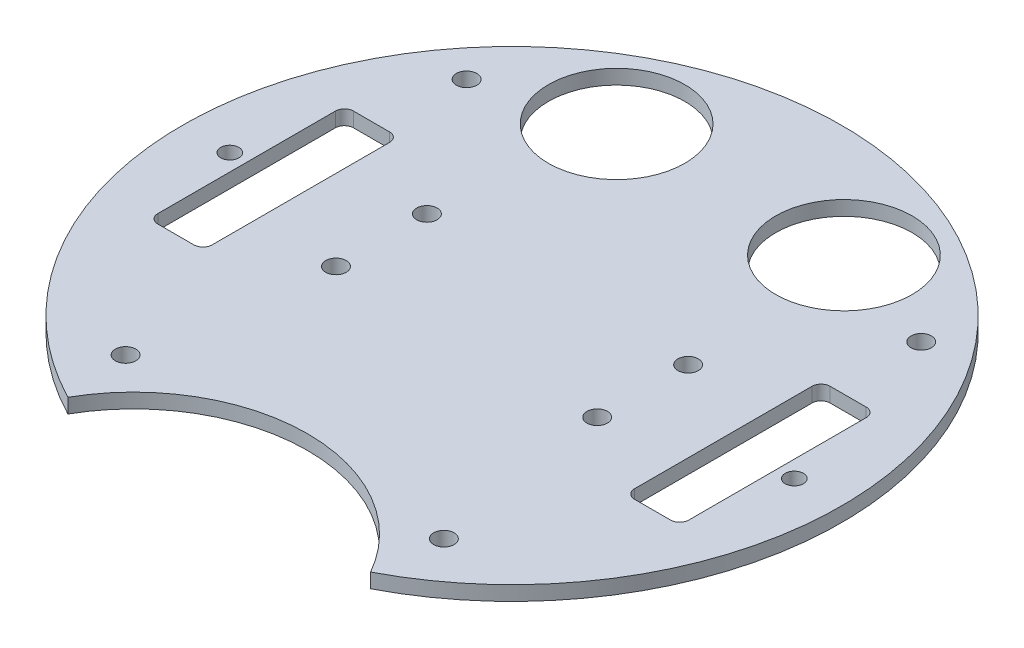
ISO-10303-21;
HEADER;
FILE_DESCRIPTION(('STEP AP214'),'2;1');
FILE_NAME('part.step','',(''),(''),'','','');
FILE_SCHEMA(('AUTOMOTIVE_DESIGN { 1 0 10303 214 1 1 1 1 }'));
ENDSEC;
DATA;
#1=APPLICATION_CONTEXT('core data for automotive mechanical design processes');
#2=APPLICATION_PROTOCOL_DEFINITION('international standard','automotive_design',2000,#1);
#3=PRODUCT_CONTEXT('',#1,'mechanical');
#4=PRODUCT('Part','Part','',(#3));
#5=PRODUCT_RELATED_PRODUCT_CATEGORY('part','',(#4));
#6=PRODUCT_DEFINITION_FORMATION('','',#4);
#7=PRODUCT_DEFINITION_CONTEXT('part definition',#1,'design');
#8=PRODUCT_DEFINITION('design','',#6,#7);
#9=PRODUCT_DEFINITION_SHAPE('','',#8);
#10=(LENGTH_UNIT() NAMED_UNIT(*) SI_UNIT(.MILLI.,.METRE.));
#11=(NAMED_UNIT(*) PLANE_ANGLE_UNIT() SI_UNIT($,.RADIAN.));
#12=(NAMED_UNIT(*) SI_UNIT($,.STERADIAN.) SOLID_ANGLE_UNIT());
#13=UNCERTAINTY_MEASURE_WITH_UNIT(LENGTH_MEASURE(1.E-05),#10,'distance_accuracy_value','');
#14=(GEOMETRIC_REPRESENTATION_CONTEXT(3) GLOBAL_UNCERTAINTY_ASSIGNED_CONTEXT((#13)) GLOBAL_UNIT_ASSIGNED_CONTEXT((#10,
#11,#12)) REPRESENTATION_CONTEXT('',''));
#15=CARTESIAN_POINT('',(0.,0.,0.));
#16=DIRECTION('',(0.,0.,1.));
#17=DIRECTION('',(1.,0.,0.));
#18=AXIS2_PLACEMENT_3D('',#15,#16,#17);
#19=CARTESIAN_POINT('',(0.,3.2,83.2397996376034));
#20=DIRECTION('',(0.,-1.,0.));
#21=DIRECTION('',(0.,0.,-1.));
#22=AXIS2_PLACEMENT_3D('',#19,#20,#21);
#23=CYLINDRICAL_SURFACE('',#22,38.25);
#24=CARTESIAN_POINT('',(0.,0.,83.2397996376034));
#25=DIRECTION('',(0.,-1.,0.));
#26=DIRECTION('',(0.,0.,1.));
#27=AXIS2_PLACEMENT_3D('',#24,#25,#26);
#28=CIRCLE('',#27,38.25);
#29=CARTESIAN_POINT('',(-33.2911053697012,0.,64.4045984636458));
#30=VERTEX_POINT('',#29);
#31=CARTESIAN_POINT('',(33.2911053697012,0.,64.4045984636458));
#32=VERTEX_POINT('',#31);
#33=EDGE_CURVE('E337',#30,#32,#28,.T.);
#34=ORIENTED_EDGE('',*,*,#33,.T.);
#35=DIRECTION('',(0.,-1.,0.));
#36=VECTOR('',#35,1.);
#37=CARTESIAN_POINT('',(33.2911053697012,3.2,64.4045984636458));
#38=LINE('',#37,#36);
#39=CARTESIAN_POINT('',(33.2911053697012,3.2,64.4045984636458));
#40=VERTEX_POINT('',#39);
#41=EDGE_CURVE('E11',#40,#32,#38,.T.);
#42=ORIENTED_EDGE('',*,*,#41,.F.);
#43=CARTESIAN_POINT('',(0.,3.2,83.2397996376034));
#44=DIRECTION('',(0.,-1.,0.));
#45=DIRECTION('',(0.,0.,1.));
#46=AXIS2_PLACEMENT_3D('',#43,#44,#45);
#47=CIRCLE('',#46,38.25);
#48=CARTESIAN_POINT('',(-33.2911053697012,3.2,64.4045984636458));
#49=VERTEX_POINT('',#48);
#50=EDGE_CURVE('E340',#49,#40,#47,.T.);
#51=ORIENTED_EDGE('',*,*,#50,.F.);
#52=DIRECTION('',(0.,-1.,0.));
#53=VECTOR('',#52,1.);
#54=CARTESIAN_POINT('',(-33.2911053697012,3.2,64.4045984636458));
#55=LINE('',#54,#53);
#56=EDGE_CURVE('E39',#49,#30,#55,.T.);
#57=ORIENTED_EDGE('',*,*,#56,.T.);
#58=EDGE_LOOP('',(#34,#42,#51,#57));
#59=FACE_BOUND('',#58,.T.);
#60=ADVANCED_FACE('F32',(#59),#23,.F.);
#61=CARTESIAN_POINT('',(0.,3.2,0.));
#62=DIRECTION('',(0.,-1.,0.));
#63=DIRECTION('',(0.,0.,-1.));
#64=AXIS2_PLACEMENT_3D('',#61,#62,#63);
#65=CYLINDRICAL_SURFACE('',#64,72.5);
#66=CARTESIAN_POINT('',(0.,0.,0.));
#67=DIRECTION('',(0.,1.,0.));
#68=DIRECTION('',(0.,0.,1.));
#69=AXIS2_PLACEMENT_3D('',#66,#67,#68);
#70=CIRCLE('',#69,72.5);
#71=EDGE_CURVE('E344',#32,#30,#70,.T.);
#72=ORIENTED_EDGE('',*,*,#71,.T.);
#73=ORIENTED_EDGE('',*,*,#56,.F.);
#74=CARTESIAN_POINT('',(0.,3.2,0.));
#75=DIRECTION('',(0.,1.,0.));
#76=DIRECTION('',(0.,0.,1.));
#77=AXIS2_PLACEMENT_3D('',#74,#75,#76);
#78=CIRCLE('',#77,72.5);
#79=EDGE_CURVE('E343',#40,#49,#78,.T.);
#80=ORIENTED_EDGE('',*,*,#79,.F.);
#81=ORIENTED_EDGE('',*,*,#41,.T.);
#82=EDGE_LOOP('',(#72,#73,#80,#81));
#83=FACE_BOUND('',#82,.T.);
#84=ADVANCED_FACE('F356',(#83),#65,.T.);
#85=CARTESIAN_POINT('',(0.,3.2,41.6198998188017));
#86=DIRECTION('',(0.,1.,0.));
#87=DIRECTION('',(0.,0.,1.));
#88=AXIS2_PLACEMENT_3D('',#85,#86,#87);
#89=PLANE('',#88);
#90=CARTESIAN_POINT('',(-35.,3.2,50.));
#91=DIRECTION('',(0.,1.,0.));
#92=DIRECTION('',(0.,0.,1.));
#93=AXIS2_PLACEMENT_3D('',#90,#91,#92);
#94=CIRCLE('',#93,2.25);
#95=CARTESIAN_POINT('',(-35.,3.2,52.25));
#96=VERTEX_POINT('',#95);
#97=EDGE_CURVE('E671',#96,#96,#94,.T.);
#98=ORIENTED_EDGE('',*,*,#97,.F.);
#99=EDGE_LOOP('',(#98));
#100=FACE_BOUND('',#99,.T.);
#101=CARTESIAN_POINT('',(35.,3.2,50.));
#102=DIRECTION('',(0.,1.,0.));
#103=DIRECTION('',(0.,0.,-1.));
#104=AXIS2_PLACEMENT_3D('',#101,#102,#103);
#105=CIRCLE('',#104,2.25);
#106=CARTESIAN_POINT('',(35.,3.2,47.7499999999999));
#107=VERTEX_POINT('',#106);
#108=EDGE_CURVE('E677',#107,#107,#105,.T.);
#109=ORIENTED_EDGE('',*,*,#108,.F.);
#110=EDGE_LOOP('',(#109));
#111=FACE_BOUND('',#110,.T.);
#112=CARTESIAN_POINT('',(50.,3.2,-40.));
#113=DIRECTION('',(0.,1.,0.));
#114=DIRECTION('',(0.,0.,-1.));
#115=AXIS2_PLACEMENT_3D('',#112,#113,#114);
#116=CIRCLE('',#115,2.25);
#117=CARTESIAN_POINT('',(50.,3.2,-42.25));
#118=VERTEX_POINT('',#117);
#119=EDGE_CURVE('E685',#118,#118,#116,.T.);
#120=ORIENTED_EDGE('',*,*,#119,.F.);
#121=EDGE_LOOP('',(#120));
#122=FACE_BOUND('',#121,.T.);
#123=CARTESIAN_POINT('',(-50.,3.2,-40.));
#124=DIRECTION('',(0.,1.,0.));
#125=DIRECTION('',(0.,0.,1.));
#126=AXIS2_PLACEMENT_3D('',#123,#124,#125);
#127=CIRCLE('',#126,2.25);
#128=CARTESIAN_POINT('',(-50.,3.2,-37.75));
#129=VERTEX_POINT('',#128);
#130=EDGE_CURVE('E674',#129,#129,#127,.T.);
#131=ORIENTED_EDGE('',*,*,#130,.F.);
#132=EDGE_LOOP('',(#131));
#133=FACE_BOUND('',#132,.T.);
#134=CARTESIAN_POINT('',(56.3857864376268,3.2,19.5201365909513));
#135=DIRECTION('',(0.,1.,0.));
#136=DIRECTION('',(0.,0.,-1.));
#137=AXIS2_PLACEMENT_3D('',#134,#135,#136);
#138=CIRCLE('',#137,2.);
#139=CARTESIAN_POINT('',(56.3857864376268,3.2,21.5201365909513));
#140=VERTEX_POINT('',#139);
#141=CARTESIAN_POINT('',(58.3857864376268,3.2,19.5201365909513));
#142=VERTEX_POINT('',#141);
#143=EDGE_CURVE('E206',#140,#142,#138,.T.);
#144=ORIENTED_EDGE('',*,*,#143,.F.);
#145=DIRECTION('',(1.,0.,0.));
#146=VECTOR('',#145,1.);
#147=CARTESIAN_POINT('',(56.3857864376268,3.2,21.5201365909513));
#148=LINE('',#147,#146);
#149=CARTESIAN_POINT('',(48.454213562373,3.2,21.5201365909513));
#150=VERTEX_POINT('',#149);
#151=EDGE_CURVE('E203',#150,#140,#148,.T.);
#152=ORIENTED_EDGE('',*,*,#151,.F.);
#153=CARTESIAN_POINT('',(48.454213562373,3.2,19.5201365909513));
#154=DIRECTION('',(0.,1.,0.));
#155=DIRECTION('',(0.,0.,-1.));
#156=AXIS2_PLACEMENT_3D('',#153,#154,#155);
#157=CIRCLE('',#156,2.);
#158=CARTESIAN_POINT('',(46.454213562373,3.2,19.5201365909513));
#159=VERTEX_POINT('',#158);
#160=EDGE_CURVE('E201',#159,#150,#157,.T.);
#161=ORIENTED_EDGE('',*,*,#160,.F.);
#162=DIRECTION('',(0.,0.,1.));
#163=VECTOR('',#162,1.);
#164=CARTESIAN_POINT('',(46.454213562373,3.2,-19.5201365909514));
#165=LINE('',#164,#163);
#166=CARTESIAN_POINT('',(46.454213562373,3.2,-19.5201365909514));
#167=VERTEX_POINT('',#166);
#168=EDGE_CURVE('E198',#167,#159,#165,.T.);
#169=ORIENTED_EDGE('',*,*,#168,.F.);
#170=CARTESIAN_POINT('',(48.454213562373,3.2,-19.5201365909514));
#171=DIRECTION('',(0.,1.,0.));
#172=DIRECTION('',(0.,0.,1.));
#173=AXIS2_PLACEMENT_3D('',#170,#171,#172);
#174=CIRCLE('',#173,2.);
#175=CARTESIAN_POINT('',(48.454213562373,3.2,-21.5201365909514));
#176=VERTEX_POINT('',#175);
#177=EDGE_CURVE('E196',#176,#167,#174,.T.);
#178=ORIENTED_EDGE('',*,*,#177,.F.);
#179=DIRECTION('',(-1.,0.,0.));
#180=VECTOR('',#179,1.);
#181=CARTESIAN_POINT('',(56.3857864376268,3.2,-21.5201365909514));
#182=LINE('',#181,#180);
#183=CARTESIAN_POINT('',(56.3857864376268,3.2,-21.5201365909514));
#184=VERTEX_POINT('',#183);
#185=EDGE_CURVE('E193',#184,#176,#182,.T.);
#186=ORIENTED_EDGE('',*,*,#185,.F.);
#187=CARTESIAN_POINT('',(56.3857864376268,3.2,-19.5201365909514));
#188=DIRECTION('',(0.,1.,0.));
#189=DIRECTION('',(0.,0.,-1.));
#190=AXIS2_PLACEMENT_3D('',#187,#188,#189);
#191=CIRCLE('',#190,1.99999999999999);
#192=CARTESIAN_POINT('',(58.3857864376268,3.2,-19.5201365909514));
#193=VERTEX_POINT('',#192);
#194=EDGE_CURVE('E172',#193,#184,#191,.T.);
#195=ORIENTED_EDGE('',*,*,#194,.F.);
#196=DIRECTION('',(0.,0.,-1.));
#197=VECTOR('',#196,1.);
#198=CARTESIAN_POINT('',(58.3857864376268,3.2,-19.5201365909514));
#199=LINE('',#198,#197);
#200=EDGE_CURVE('E169',#142,#193,#199,.T.);
#201=ORIENTED_EDGE('',*,*,#200,.F.);
#202=EDGE_LOOP('',(#144,#152,#161,#169,#178,#186,#195,#201));
#203=FACE_BOUND('',#202,.T.);
#204=CARTESIAN_POINT('',(-56.3857864376268,3.2,-19.5201365909514));
#205=DIRECTION('',(0.,1.,0.));
#206=DIRECTION('',(0.,0.,1.));
#207=AXIS2_PLACEMENT_3D('',#204,#205,#206);
#208=CIRCLE('',#207,1.99999999999999);
#209=CARTESIAN_POINT('',(-56.3857864376268,3.2,-21.5201365909514));
#210=VERTEX_POINT('',#209);
#211=CARTESIAN_POINT('',(-58.3857864376268,3.2,-19.5201365909514));
#212=VERTEX_POINT('',#211);
#213=EDGE_CURVE('E265',#210,#212,#208,.T.);
#214=ORIENTED_EDGE('',*,*,#213,.F.);
#215=DIRECTION('',(-1.,0.,0.));
#216=VECTOR('',#215,1.);
#217=CARTESIAN_POINT('',(-56.3857864376268,3.2,-21.5201365909514));
#218=LINE('',#217,#216);
#219=CARTESIAN_POINT('',(-48.454213562373,3.2,-21.5201365909514));
#220=VERTEX_POINT('',#219);
#221=EDGE_CURVE('E262',#220,#210,#218,.T.);
#222=ORIENTED_EDGE('',*,*,#221,.F.);
#223=CARTESIAN_POINT('',(-48.454213562373,3.2,-19.5201365909514));
#224=DIRECTION('',(0.,1.,0.));
#225=DIRECTION('',(0.,0.,-1.));
#226=AXIS2_PLACEMENT_3D('',#223,#224,#225);
#227=CIRCLE('',#226,2.);
#228=CARTESIAN_POINT('',(-46.454213562373,3.2,-19.5201365909514));
#229=VERTEX_POINT('',#228);
#230=EDGE_CURVE('E260',#229,#220,#227,.T.);
#231=ORIENTED_EDGE('',*,*,#230,.F.);
#232=DIRECTION('',(0.,0.,-1.));
#233=VECTOR('',#232,1.);
#234=CARTESIAN_POINT('',(-46.454213562373,3.2,-19.5201365909514));
#235=LINE('',#234,#233);
#236=CARTESIAN_POINT('',(-46.454213562373,3.2,19.5201365909513));
#237=VERTEX_POINT('',#236);
#238=EDGE_CURVE('E257',#237,#229,#235,.T.);
#239=ORIENTED_EDGE('',*,*,#238,.F.);
#240=CARTESIAN_POINT('',(-48.454213562373,3.2,19.5201365909513));
#241=DIRECTION('',(0.,1.,0.));
#242=DIRECTION('',(0.,0.,1.));
#243=AXIS2_PLACEMENT_3D('',#240,#241,#242);
#244=CIRCLE('',#243,2.);
#245=CARTESIAN_POINT('',(-48.454213562373,3.2,21.5201365909513));
#246=VERTEX_POINT('',#245);
#247=EDGE_CURVE('E255',#246,#237,#244,.T.);
#248=ORIENTED_EDGE('',*,*,#247,.F.);
#249=DIRECTION('',(1.,0.,0.));
#250=VECTOR('',#249,1.);
#251=CARTESIAN_POINT('',(-56.3857864376268,3.2,21.5201365909513));
#252=LINE('',#251,#250);
#253=CARTESIAN_POINT('',(-56.3857864376268,3.2,21.5201365909513));
#254=VERTEX_POINT('',#253);
#255=EDGE_CURVE('E252',#254,#246,#252,.T.);
#256=ORIENTED_EDGE('',*,*,#255,.F.);
#257=CARTESIAN_POINT('',(-56.3857864376268,3.2,19.5201365909513));
#258=DIRECTION('',(0.,1.,0.));
#259=DIRECTION('',(0.,0.,1.));
#260=AXIS2_PLACEMENT_3D('',#257,#258,#259);
#261=CIRCLE('',#260,2.);
#262=CARTESIAN_POINT('',(-58.3857864376268,3.2,19.5201365909513));
#263=VERTEX_POINT('',#262);
#264=EDGE_CURVE('E212',#263,#254,#261,.T.);
#265=ORIENTED_EDGE('',*,*,#264,.F.);
#266=DIRECTION('',(0.,0.,1.));
#267=VECTOR('',#266,1.);
#268=CARTESIAN_POINT('',(-58.3857864376268,3.2,-19.5201365909514));
#269=LINE('',#268,#267);
#270=EDGE_CURVE('E232',#212,#263,#269,.T.);
#271=ORIENTED_EDGE('',*,*,#270,.F.);
#272=EDGE_LOOP('',(#214,#222,#231,#239,#248,#256,#265,#271));
#273=FACE_BOUND('',#272,.T.);
#274=CARTESIAN_POINT('',(25.,3.2,-48.));
#275=DIRECTION('',(0.,1.,0.));
#276=DIRECTION('',(0.,0.,-1.));
#277=AXIS2_PLACEMENT_3D('',#274,#275,#276);
#278=CIRCLE('',#277,15.);
#279=CARTESIAN_POINT('',(25.,3.2,-63.));
#280=VERTEX_POINT('',#279);
#281=EDGE_CURVE('E271',#280,#280,#278,.T.);
#282=ORIENTED_EDGE('',*,*,#281,.F.);
#283=EDGE_LOOP('',(#282));
#284=FACE_BOUND('',#283,.T.);
#285=CARTESIAN_POINT('',(-25.,3.2,-48.));
#286=DIRECTION('',(0.,1.,0.));
#287=DIRECTION('',(0.,0.,1.));
#288=AXIS2_PLACEMENT_3D('',#285,#286,#287);
#289=CIRCLE('',#288,15.);
#290=CARTESIAN_POINT('',(-25.,3.2,-33.));
#291=VERTEX_POINT('',#290);
#292=EDGE_CURVE('E295',#291,#291,#289,.T.);
#293=ORIENTED_EDGE('',*,*,#292,.F.);
#294=EDGE_LOOP('',(#293));
#295=FACE_BOUND('',#294,.T.);
#296=CARTESIAN_POINT('',(-28.7299999999999,3.2,9.99999999999995));
#297=DIRECTION('',(0.,-1.,0.));
#298=DIRECTION('',(0.,0.,-1.));
#299=AXIS2_PLACEMENT_3D('',#296,#297,#298);
#300=CIRCLE('',#299,2.25);
#301=CARTESIAN_POINT('',(-28.7299999999999,3.2,7.74999999999995));
#302=VERTEX_POINT('',#301);
#303=EDGE_CURVE('E304',#302,#302,#300,.T.);
#304=ORIENTED_EDGE('',*,*,#303,.T.);
#305=EDGE_LOOP('',(#304));
#306=FACE_BOUND('',#305,.T.);
#307=CARTESIAN_POINT('',(-28.7299999999999,3.2,-10.0000000000001));
#308=DIRECTION('',(0.,-1.,0.));
#309=DIRECTION('',(0.,0.,-1.));
#310=AXIS2_PLACEMENT_3D('',#307,#308,#309);
#311=CIRCLE('',#310,2.25);
#312=CARTESIAN_POINT('',(-28.7299999999999,3.2,-12.2500000000001));
#313=VERTEX_POINT('',#312);
#314=EDGE_CURVE('E311',#313,#313,#311,.T.);
#315=ORIENTED_EDGE('',*,*,#314,.T.);
#316=EDGE_LOOP('',(#315));
#317=FACE_BOUND('',#316,.T.);
#318=CARTESIAN_POINT('',(28.7299999999999,3.2,-10.));
#319=DIRECTION('',(0.,-1.,0.));
#320=DIRECTION('',(0.,0.,1.));
#321=AXIS2_PLACEMENT_3D('',#318,#319,#320);
#322=CIRCLE('',#321,2.25000000000001);
#323=CARTESIAN_POINT('',(28.7299999999999,3.2,-7.75000000000004));
#324=VERTEX_POINT('',#323);
#325=EDGE_CURVE('E317',#324,#324,#322,.T.);
#326=ORIENTED_EDGE('',*,*,#325,.T.);
#327=EDGE_LOOP('',(#326));
#328=FACE_BOUND('',#327,.T.);
#329=CARTESIAN_POINT('',(28.7299999999999,3.2,9.99999999999996));
#330=DIRECTION('',(0.,-1.,0.));
#331=DIRECTION('',(0.,0.,1.));
#332=AXIS2_PLACEMENT_3D('',#329,#330,#331);
#333=CIRCLE('',#332,2.25000000000001);
#334=CARTESIAN_POINT('',(28.7299999999999,3.2,12.25));
#335=VERTEX_POINT('',#334);
#336=EDGE_CURVE('E323',#335,#335,#333,.T.);
#337=ORIENTED_EDGE('',*,*,#336,.T.);
#338=EDGE_LOOP('',(#337));
#339=FACE_BOUND('',#338,.T.);
#340=CARTESIAN_POINT('',(62.08,3.2,0.));
#341=DIRECTION('',(0.,-1.,0.));
#342=DIRECTION('',(0.,0.,1.));
#343=AXIS2_PLACEMENT_3D('',#340,#341,#342);
#344=CIRCLE('',#343,1.99999999999999);
#345=CARTESIAN_POINT('',(62.08,3.2,1.99999999999992));
#346=VERTEX_POINT('',#345);
#347=EDGE_CURVE('E329',#346,#346,#344,.T.);
#348=ORIENTED_EDGE('',*,*,#347,.T.);
#349=EDGE_LOOP('',(#348));
#350=FACE_BOUND('',#349,.T.);
#351=CARTESIAN_POINT('',(-62.08,3.2,0.));
#352=DIRECTION('',(0.,-1.,0.));
#353=DIRECTION('',(0.,0.,-1.));
#354=AXIS2_PLACEMENT_3D('',#351,#352,#353);
#355=CIRCLE('',#354,2.);
#356=CARTESIAN_POINT('',(-62.08,3.2,-2.00000000000008));
#357=VERTEX_POINT('',#356);
#358=EDGE_CURVE('E334',#357,#357,#355,.T.);
#359=ORIENTED_EDGE('',*,*,#358,.T.);
#360=EDGE_LOOP('',(#359));
#361=FACE_BOUND('',#360,.T.);
#362=ORIENTED_EDGE('',*,*,#50,.T.);
#363=ORIENTED_EDGE('',*,*,#79,.T.);
#364=EDGE_LOOP('',(#362,#363));
#365=FACE_BOUND('',#364,.T.);
#366=ADVANCED_FACE('F358',(#100,#111,#122,#133,#203,#273,#284,#295,#306,#317,#328,#339,#350,
#361,#365),#89,.T.);
#367=CARTESIAN_POINT('',(0.,0.,41.6198998188017));
#368=DIRECTION('',(0.,1.,0.));
#369=DIRECTION('',(0.,0.,1.));
#370=AXIS2_PLACEMENT_3D('',#367,#368,#369);
#371=PLANE('',#370);
#372=CARTESIAN_POINT('',(-35.,0.,50.));
#373=DIRECTION('',(0.,1.,0.));
#374=DIRECTION('',(0.,0.,1.));
#375=AXIS2_PLACEMENT_3D('',#372,#373,#374);
#376=CIRCLE('',#375,2.25);
#377=CARTESIAN_POINT('',(-35.,0.,52.25));
#378=VERTEX_POINT('',#377);
#379=EDGE_CURVE('E669',#378,#378,#376,.T.);
#380=ORIENTED_EDGE('',*,*,#379,.T.);
#381=EDGE_LOOP('',(#380));
#382=FACE_BOUND('',#381,.T.);
#383=CARTESIAN_POINT('',(35.,0.,50.));
#384=DIRECTION('',(0.,1.,0.));
#385=DIRECTION('',(0.,0.,-1.));
#386=AXIS2_PLACEMENT_3D('',#383,#384,#385);
#387=CIRCLE('',#386,2.25);
#388=CARTESIAN_POINT('',(35.,0.,47.7499999999999));
#389=VERTEX_POINT('',#388);
#390=EDGE_CURVE('E672',#389,#389,#387,.T.);
#391=ORIENTED_EDGE('',*,*,#390,.T.);
#392=EDGE_LOOP('',(#391));
#393=FACE_BOUND('',#392,.T.);
#394=CARTESIAN_POINT('',(50.,0.,-40.));
#395=DIRECTION('',(0.,1.,0.));
#396=DIRECTION('',(0.,0.,-1.));
#397=AXIS2_PLACEMENT_3D('',#394,#395,#396);
#398=CIRCLE('',#397,2.25);
#399=CARTESIAN_POINT('',(50.,0.,-42.25));
#400=VERTEX_POINT('',#399);
#401=EDGE_CURVE('E682',#400,#400,#398,.T.);
#402=ORIENTED_EDGE('',*,*,#401,.T.);
#403=EDGE_LOOP('',(#402));
#404=FACE_BOUND('',#403,.T.);
#405=CARTESIAN_POINT('',(-50.,0.,-40.));
#406=DIRECTION('',(0.,1.,0.));
#407=DIRECTION('',(0.,0.,1.));
#408=AXIS2_PLACEMENT_3D('',#405,#406,#407);
#409=CIRCLE('',#408,2.25);
#410=CARTESIAN_POINT('',(-50.,0.,-37.75));
#411=VERTEX_POINT('',#410);
#412=EDGE_CURVE('E194',#411,#411,#409,.T.);
#413=ORIENTED_EDGE('',*,*,#412,.T.);
#414=EDGE_LOOP('',(#413));
#415=FACE_BOUND('',#414,.T.);
#416=DIRECTION('',(1.,0.,0.));
#417=VECTOR('',#416,1.);
#418=CARTESIAN_POINT('',(56.3857864376268,0.,21.5201365909513));
#419=LINE('',#418,#417);
#420=CARTESIAN_POINT('',(48.454213562373,0.,21.5201365909513));
#421=VERTEX_POINT('',#420);
#422=CARTESIAN_POINT('',(56.3857864376268,0.,21.5201365909513));
#423=VERTEX_POINT('',#422);
#424=EDGE_CURVE('E187',#421,#423,#419,.T.);
#425=ORIENTED_EDGE('',*,*,#424,.T.);
#426=CARTESIAN_POINT('',(56.3857864376268,0.,19.5201365909513));
#427=DIRECTION('',(0.,1.,0.));
#428=DIRECTION('',(0.,0.,-1.));
#429=AXIS2_PLACEMENT_3D('',#426,#427,#428);
#430=CIRCLE('',#429,2.);
#431=CARTESIAN_POINT('',(58.3857864376268,0.,19.5201365909513));
#432=VERTEX_POINT('',#431);
#433=EDGE_CURVE('E189',#423,#432,#430,.T.);
#434=ORIENTED_EDGE('',*,*,#433,.T.);
#435=DIRECTION('',(0.,0.,-1.));
#436=VECTOR('',#435,1.);
#437=CARTESIAN_POINT('',(58.3857864376268,0.,-19.5201365909514));
#438=LINE('',#437,#436);
#439=CARTESIAN_POINT('',(58.3857864376268,0.,-19.5201365909514));
#440=VERTEX_POINT('',#439);
#441=EDGE_CURVE('E166',#432,#440,#438,.T.);
#442=ORIENTED_EDGE('',*,*,#441,.T.);
#443=CARTESIAN_POINT('',(56.3857864376268,0.,-19.5201365909514));
#444=DIRECTION('',(0.,1.,0.));
#445=DIRECTION('',(0.,0.,-1.));
#446=AXIS2_PLACEMENT_3D('',#443,#444,#445);
#447=CIRCLE('',#446,1.99999999999999);
#448=CARTESIAN_POINT('',(56.3857864376268,0.,-21.5201365909514));
#449=VERTEX_POINT('',#448);
#450=EDGE_CURVE('E160',#440,#449,#447,.T.);
#451=ORIENTED_EDGE('',*,*,#450,.T.);
#452=DIRECTION('',(-1.,0.,0.));
#453=VECTOR('',#452,1.);
#454=CARTESIAN_POINT('',(56.3857864376268,0.,-21.5201365909514));
#455=LINE('',#454,#453);
#456=CARTESIAN_POINT('',(48.454213562373,0.,-21.5201365909514));
#457=VERTEX_POINT('',#456);
#458=EDGE_CURVE('E164',#449,#457,#455,.T.);
#459=ORIENTED_EDGE('',*,*,#458,.T.);
#460=CARTESIAN_POINT('',(48.454213562373,0.,-19.5201365909514));
#461=DIRECTION('',(0.,1.,0.));
#462=DIRECTION('',(0.,0.,1.));
#463=AXIS2_PLACEMENT_3D('',#460,#461,#462);
#464=CIRCLE('',#463,2.);
#465=CARTESIAN_POINT('',(46.454213562373,0.,-19.5201365909514));
#466=VERTEX_POINT('',#465);
#467=EDGE_CURVE('E54',#457,#466,#464,.T.);
#468=ORIENTED_EDGE('',*,*,#467,.T.);
#469=DIRECTION('',(0.,0.,1.));
#470=VECTOR('',#469,1.);
#471=CARTESIAN_POINT('',(46.454213562373,0.,-19.5201365909514));
#472=LINE('',#471,#470);
#473=CARTESIAN_POINT('',(46.454213562373,0.,19.5201365909513));
#474=VERTEX_POINT('',#473);
#475=EDGE_CURVE('E178',#466,#474,#472,.T.);
#476=ORIENTED_EDGE('',*,*,#475,.T.);
#477=CARTESIAN_POINT('',(48.454213562373,0.,19.5201365909513));
#478=DIRECTION('',(0.,1.,0.));
#479=DIRECTION('',(0.,0.,-1.));
#480=AXIS2_PLACEMENT_3D('',#477,#478,#479);
#481=CIRCLE('',#480,2.);
#482=EDGE_CURVE('E184',#474,#421,#481,.T.);
#483=ORIENTED_EDGE('',*,*,#482,.T.);
#484=EDGE_LOOP('',(#425,#434,#442,#451,#459,#468,#476,#483));
#485=FACE_BOUND('',#484,.T.);
#486=DIRECTION('',(-1.,0.,0.));
#487=VECTOR('',#486,1.);
#488=CARTESIAN_POINT('',(-56.3857864376268,0.,-21.5201365909514));
#489=LINE('',#488,#487);
#490=CARTESIAN_POINT('',(-48.454213562373,0.,-21.5201365909514));
#491=VERTEX_POINT('',#490);
#492=CARTESIAN_POINT('',(-56.3857864376268,0.,-21.5201365909514));
#493=VERTEX_POINT('',#492);
#494=EDGE_CURVE('E242',#491,#493,#489,.T.);
#495=ORIENTED_EDGE('',*,*,#494,.T.);
#496=CARTESIAN_POINT('',(-56.3857864376268,0.,-19.5201365909514));
#497=DIRECTION('',(0.,1.,0.));
#498=DIRECTION('',(0.,0.,1.));
#499=AXIS2_PLACEMENT_3D('',#496,#497,#498);
#500=CIRCLE('',#499,1.99999999999999);
#501=CARTESIAN_POINT('',(-58.3857864376268,0.,-19.5201365909514));
#502=VERTEX_POINT('',#501);
#503=EDGE_CURVE('E245',#493,#502,#500,.T.);
#504=ORIENTED_EDGE('',*,*,#503,.T.);
#505=DIRECTION('',(0.,0.,1.));
#506=VECTOR('',#505,1.);
#507=CARTESIAN_POINT('',(-58.3857864376268,0.,-19.5201365909514));
#508=LINE('',#507,#506);
#509=CARTESIAN_POINT('',(-58.3857864376268,0.,19.5201365909513));
#510=VERTEX_POINT('',#509);
#511=EDGE_CURVE('E247',#502,#510,#508,.T.);
#512=ORIENTED_EDGE('',*,*,#511,.T.);
#513=CARTESIAN_POINT('',(-56.3857864376268,0.,19.5201365909513));
#514=DIRECTION('',(0.,1.,0.));
#515=DIRECTION('',(0.,0.,1.));
#516=AXIS2_PLACEMENT_3D('',#513,#514,#515);
#517=CIRCLE('',#516,2.);
#518=CARTESIAN_POINT('',(-56.3857864376268,0.,21.5201365909513));
#519=VERTEX_POINT('',#518);
#520=EDGE_CURVE('E228',#510,#519,#517,.T.);
#521=ORIENTED_EDGE('',*,*,#520,.T.);
#522=DIRECTION('',(1.,0.,0.));
#523=VECTOR('',#522,1.);
#524=CARTESIAN_POINT('',(-56.3857864376268,0.,21.5201365909513));
#525=LINE('',#524,#523);
#526=CARTESIAN_POINT('',(-48.454213562373,0.,21.5201365909513));
#527=VERTEX_POINT('',#526);
#528=EDGE_CURVE('E231',#519,#527,#525,.T.);
#529=ORIENTED_EDGE('',*,*,#528,.T.);
#530=CARTESIAN_POINT('',(-48.454213562373,0.,19.5201365909513));
#531=DIRECTION('',(0.,1.,0.));
#532=DIRECTION('',(0.,0.,1.));
#533=AXIS2_PLACEMENT_3D('',#530,#531,#532);
#534=CIRCLE('',#533,2.);
#535=CARTESIAN_POINT('',(-46.454213562373,0.,19.5201365909513));
#536=VERTEX_POINT('',#535);
#537=EDGE_CURVE('E235',#527,#536,#534,.T.);
#538=ORIENTED_EDGE('',*,*,#537,.T.);
#539=DIRECTION('',(0.,0.,-1.));
#540=VECTOR('',#539,1.);
#541=CARTESIAN_POINT('',(-46.454213562373,0.,-19.5201365909514));
#542=LINE('',#541,#540);
#543=CARTESIAN_POINT('',(-46.454213562373,0.,-19.5201365909514));
#544=VERTEX_POINT('',#543);
#545=EDGE_CURVE('E237',#536,#544,#542,.T.);
#546=ORIENTED_EDGE('',*,*,#545,.T.);
#547=CARTESIAN_POINT('',(-48.454213562373,0.,-19.5201365909514));
#548=DIRECTION('',(0.,1.,0.));
#549=DIRECTION('',(0.,0.,-1.));
#550=AXIS2_PLACEMENT_3D('',#547,#548,#549);
#551=CIRCLE('',#550,2.);
#552=EDGE_CURVE('E240',#544,#491,#551,.T.);
#553=ORIENTED_EDGE('',*,*,#552,.T.);
#554=EDGE_LOOP('',(#495,#504,#512,#521,#529,#538,#546,#553));
#555=FACE_BOUND('',#554,.T.);
#556=CARTESIAN_POINT('',(25.,0.,-48.));
#557=DIRECTION('',(0.,1.,0.));
#558=DIRECTION('',(0.,0.,-1.));
#559=AXIS2_PLACEMENT_3D('',#556,#557,#558);
#560=CIRCLE('',#559,15.);
#561=CARTESIAN_POINT('',(25.,0.,-63.));
#562=VERTEX_POINT('',#561);
#563=EDGE_CURVE('E292',#562,#562,#560,.T.);
#564=ORIENTED_EDGE('',*,*,#563,.T.);
#565=EDGE_LOOP('',(#564));
#566=FACE_BOUND('',#565,.T.);
#567=CARTESIAN_POINT('',(-25.,0.,-48.));
#568=DIRECTION('',(0.,1.,0.));
#569=DIRECTION('',(0.,0.,1.));
#570=AXIS2_PLACEMENT_3D('',#567,#568,#569);
#571=CIRCLE('',#570,15.);
#572=CARTESIAN_POINT('',(-25.,0.,-33.));
#573=VERTEX_POINT('',#572);
#574=EDGE_CURVE('E298',#573,#573,#571,.T.);
#575=ORIENTED_EDGE('',*,*,#574,.T.);
#576=EDGE_LOOP('',(#575));
#577=FACE_BOUND('',#576,.T.);
#578=CARTESIAN_POINT('',(-28.7299999999999,0.,9.99999999999995));
#579=DIRECTION('',(0.,-1.,0.));
#580=DIRECTION('',(0.,0.,-1.));
#581=AXIS2_PLACEMENT_3D('',#578,#579,#580);
#582=CIRCLE('',#581,2.25);
#583=CARTESIAN_POINT('',(-28.7299999999999,0.,7.74999999999995));
#584=VERTEX_POINT('',#583);
#585=EDGE_CURVE('E308',#584,#584,#582,.T.);
#586=ORIENTED_EDGE('',*,*,#585,.F.);
#587=EDGE_LOOP('',(#586));
#588=FACE_BOUND('',#587,.T.);
#589=CARTESIAN_POINT('',(-28.7299999999999,0.,-10.0000000000001));
#590=DIRECTION('',(0.,-1.,0.));
#591=DIRECTION('',(0.,0.,-1.));
#592=AXIS2_PLACEMENT_3D('',#589,#590,#591);
#593=CIRCLE('',#592,2.25);
#594=CARTESIAN_POINT('',(-28.7299999999999,0.,-12.2500000000001));
#595=VERTEX_POINT('',#594);
#596=EDGE_CURVE('E314',#595,#595,#593,.T.);
#597=ORIENTED_EDGE('',*,*,#596,.F.);
#598=EDGE_LOOP('',(#597));
#599=FACE_BOUND('',#598,.T.);
#600=CARTESIAN_POINT('',(28.7299999999999,0.,-10.));
#601=DIRECTION('',(0.,-1.,0.));
#602=DIRECTION('',(0.,0.,1.));
#603=AXIS2_PLACEMENT_3D('',#600,#601,#602);
#604=CIRCLE('',#603,2.25000000000001);
#605=CARTESIAN_POINT('',(28.7299999999999,0.,-7.75000000000004));
#606=VERTEX_POINT('',#605);
#607=EDGE_CURVE('E320',#606,#606,#604,.T.);
#608=ORIENTED_EDGE('',*,*,#607,.F.);
#609=EDGE_LOOP('',(#608));
#610=FACE_BOUND('',#609,.T.);
#611=CARTESIAN_POINT('',(28.7299999999999,0.,9.99999999999996));
#612=DIRECTION('',(0.,-1.,0.));
#613=DIRECTION('',(0.,0.,1.));
#614=AXIS2_PLACEMENT_3D('',#611,#612,#613);
#615=CIRCLE('',#614,2.25000000000001);
#616=CARTESIAN_POINT('',(28.7299999999999,0.,12.25));
#617=VERTEX_POINT('',#616);
#618=EDGE_CURVE('E326',#617,#617,#615,.T.);
#619=ORIENTED_EDGE('',*,*,#618,.F.);
#620=EDGE_LOOP('',(#619));
#621=FACE_BOUND('',#620,.T.);
#622=CARTESIAN_POINT('',(62.08,0.,0.));
#623=DIRECTION('',(0.,-1.,0.));
#624=DIRECTION('',(0.,0.,1.));
#625=AXIS2_PLACEMENT_3D('',#622,#623,#624);
#626=CIRCLE('',#625,1.99999999999999);
#627=CARTESIAN_POINT('',(62.08,0.,1.99999999999992));
#628=VERTEX_POINT('',#627);
#629=EDGE_CURVE('E301',#628,#628,#626,.T.);
#630=ORIENTED_EDGE('',*,*,#629,.F.);
#631=EDGE_LOOP('',(#630));
#632=FACE_BOUND('',#631,.T.);
#633=CARTESIAN_POINT('',(-62.08,0.,0.));
#634=DIRECTION('',(0.,-1.,0.));
#635=DIRECTION('',(0.,0.,-1.));
#636=AXIS2_PLACEMENT_3D('',#633,#634,#635);
#637=CIRCLE('',#636,2.);
#638=CARTESIAN_POINT('',(-62.08,0.,-2.00000000000008));
#639=VERTEX_POINT('',#638);
#640=EDGE_CURVE('E307',#639,#639,#637,.T.);
#641=ORIENTED_EDGE('',*,*,#640,.F.);
#642=EDGE_LOOP('',(#641));
#643=FACE_BOUND('',#642,.T.);
#644=ORIENTED_EDGE('',*,*,#33,.F.);
#645=ORIENTED_EDGE('',*,*,#71,.F.);
#646=EDGE_LOOP('',(#644,#645));
#647=FACE_BOUND('',#646,.T.);
#648=ADVANCED_FACE('F162',(#382,#393,#404,#415,#485,#555,#566,#577,#588,#599,#610,#621,#632,
#643,#647),#371,.F.);
#649=CARTESIAN_POINT('',(-62.08,3.2,0.));
#650=DIRECTION('',(0.,-1.,0.));
#651=DIRECTION('',(0.,0.,-1.));
#652=AXIS2_PLACEMENT_3D('',#649,#650,#651);
#653=CYLINDRICAL_SURFACE('',#652,2.);
#654=ORIENTED_EDGE('',*,*,#358,.F.);
#655=EDGE_LOOP('',(#654));
#656=FACE_BOUND('',#655,.T.);
#657=ORIENTED_EDGE('',*,*,#640,.T.);
#658=EDGE_LOOP('',(#657));
#659=FACE_BOUND('',#658,.T.);
#660=ADVANCED_FACE('F366',(#656,#659),#653,.F.);
#661=CARTESIAN_POINT('',(62.08,3.2,0.));
#662=DIRECTION('',(0.,-1.,0.));
#663=DIRECTION('',(0.,0.,-1.));
#664=AXIS2_PLACEMENT_3D('',#661,#662,#663);
#665=CYLINDRICAL_SURFACE('',#664,1.99999999999999);
#666=ORIENTED_EDGE('',*,*,#347,.F.);
#667=EDGE_LOOP('',(#666));
#668=FACE_BOUND('',#667,.T.);
#669=ORIENTED_EDGE('',*,*,#629,.T.);
#670=EDGE_LOOP('',(#669));
#671=FACE_BOUND('',#670,.T.);
#672=ADVANCED_FACE('F389',(#668,#671),#665,.F.);
#673=CARTESIAN_POINT('',(28.7299999999999,3.2,9.99999999999996));
#674=DIRECTION('',(0.,-1.,0.));
#675=DIRECTION('',(0.,0.,-1.));
#676=AXIS2_PLACEMENT_3D('',#673,#674,#675);
#677=CYLINDRICAL_SURFACE('',#676,2.25000000000001);
#678=ORIENTED_EDGE('',*,*,#336,.F.);
#679=EDGE_LOOP('',(#678));
#680=FACE_BOUND('',#679,.T.);
#681=ORIENTED_EDGE('',*,*,#618,.T.);
#682=EDGE_LOOP('',(#681));
#683=FACE_BOUND('',#682,.T.);
#684=ADVANCED_FACE('F399',(#680,#683),#677,.F.);
#685=CARTESIAN_POINT('',(28.7299999999999,3.2,-10.));
#686=DIRECTION('',(0.,-1.,0.));
#687=DIRECTION('',(0.,0.,-1.));
#688=AXIS2_PLACEMENT_3D('',#685,#686,#687);
#689=CYLINDRICAL_SURFACE('',#688,2.25000000000001);
#690=ORIENTED_EDGE('',*,*,#325,.F.);
#691=EDGE_LOOP('',(#690));
#692=FACE_BOUND('',#691,.T.);
#693=ORIENTED_EDGE('',*,*,#607,.T.);
#694=EDGE_LOOP('',(#693));
#695=FACE_BOUND('',#694,.T.);
#696=ADVANCED_FACE('F409',(#692,#695),#689,.F.);
#697=CARTESIAN_POINT('',(-28.7299999999999,3.2,-10.0000000000001));
#698=DIRECTION('',(0.,-1.,0.));
#699=DIRECTION('',(0.,0.,-1.));
#700=AXIS2_PLACEMENT_3D('',#697,#698,#699);
#701=CYLINDRICAL_SURFACE('',#700,2.25);
#702=ORIENTED_EDGE('',*,*,#314,.F.);
#703=EDGE_LOOP('',(#702));
#704=FACE_BOUND('',#703,.T.);
#705=ORIENTED_EDGE('',*,*,#596,.T.);
#706=EDGE_LOOP('',(#705));
#707=FACE_BOUND('',#706,.T.);
#708=ADVANCED_FACE('F419',(#704,#707),#701,.F.);
#709=CARTESIAN_POINT('',(-28.7299999999999,3.2,9.99999999999995));
#710=DIRECTION('',(0.,-1.,0.));
#711=DIRECTION('',(0.,0.,-1.));
#712=AXIS2_PLACEMENT_3D('',#709,#710,#711);
#713=CYLINDRICAL_SURFACE('',#712,2.25);
#714=ORIENTED_EDGE('',*,*,#303,.F.);
#715=EDGE_LOOP('',(#714));
#716=FACE_BOUND('',#715,.T.);
#717=ORIENTED_EDGE('',*,*,#585,.T.);
#718=EDGE_LOOP('',(#717));
#719=FACE_BOUND('',#718,.T.);
#720=ADVANCED_FACE('F429',(#716,#719),#713,.F.);
#721=CARTESIAN_POINT('',(-25.,0.,-48.));
#722=DIRECTION('',(0.,1.,0.));
#723=DIRECTION('',(0.,0.,1.));
#724=AXIS2_PLACEMENT_3D('',#721,#722,#723);
#725=CYLINDRICAL_SURFACE('',#724,15.);
#726=ORIENTED_EDGE('',*,*,#574,.F.);
#727=EDGE_LOOP('',(#726));
#728=FACE_BOUND('',#727,.T.);
#729=ORIENTED_EDGE('',*,*,#292,.T.);
#730=EDGE_LOOP('',(#729));
#731=FACE_BOUND('',#730,.T.);
#732=ADVANCED_FACE('F439',(#728,#731),#725,.F.);
#733=CARTESIAN_POINT('',(25.,0.,-48.));
#734=DIRECTION('',(0.,1.,0.));
#735=DIRECTION('',(0.,0.,1.));
#736=AXIS2_PLACEMENT_3D('',#733,#734,#735);
#737=CYLINDRICAL_SURFACE('',#736,15.);
#738=ORIENTED_EDGE('',*,*,#563,.F.);
#739=EDGE_LOOP('',(#738));
#740=FACE_BOUND('',#739,.T.);
#741=ORIENTED_EDGE('',*,*,#281,.T.);
#742=EDGE_LOOP('',(#741));
#743=FACE_BOUND('',#742,.T.);
#744=ADVANCED_FACE('F449',(#740,#743),#737,.F.);
#745=CARTESIAN_POINT('',(-56.3857864376268,0.,-19.5201365909514));
#746=DIRECTION('',(0.,1.,0.));
#747=DIRECTION('',(0.,0.,1.));
#748=AXIS2_PLACEMENT_3D('',#745,#746,#747);
#749=CYLINDRICAL_SURFACE('',#748,1.99999999999999);
#750=ORIENTED_EDGE('',*,*,#503,.F.);
#751=DIRECTION('',(0.,1.,0.));
#752=VECTOR('',#751,1.);
#753=CARTESIAN_POINT('',(-56.3857864376268,0.,-21.5201365909514));
#754=LINE('',#753,#752);
#755=EDGE_CURVE('E275',#493,#210,#754,.T.);
#756=ORIENTED_EDGE('',*,*,#755,.T.);
#757=ORIENTED_EDGE('',*,*,#213,.T.);
#758=DIRECTION('',(0.,1.,0.));
#759=VECTOR('',#758,1.);
#760=CARTESIAN_POINT('',(-58.3857864376268,0.,-19.5201365909514));
#761=LINE('',#760,#759);
#762=EDGE_CURVE('E272',#502,#212,#761,.T.);
#763=ORIENTED_EDGE('',*,*,#762,.F.);
#764=EDGE_LOOP('',(#750,#756,#757,#763));
#765=FACE_BOUND('',#764,.T.);
#766=ADVANCED_FACE('F459',(#765),#749,.F.);
#767=CARTESIAN_POINT('',(-48.454213562373,0.,-19.5201365909514));
#768=DIRECTION('',(0.,1.,0.));
#769=DIRECTION('',(0.,0.,1.));
#770=AXIS2_PLACEMENT_3D('',#767,#768,#769);
#771=CYLINDRICAL_SURFACE('',#770,2.);
#772=ORIENTED_EDGE('',*,*,#552,.F.);
#773=DIRECTION('',(0.,1.,0.));
#774=VECTOR('',#773,1.);
#775=CARTESIAN_POINT('',(-46.454213562373,0.,-19.5201365909514));
#776=LINE('',#775,#774);
#777=EDGE_CURVE('E281',#544,#229,#776,.T.);
#778=ORIENTED_EDGE('',*,*,#777,.T.);
#779=ORIENTED_EDGE('',*,*,#230,.T.);
#780=DIRECTION('',(0.,1.,0.));
#781=VECTOR('',#780,1.);
#782=CARTESIAN_POINT('',(-48.454213562373,0.,-21.5201365909514));
#783=LINE('',#782,#781);
#784=EDGE_CURVE('E278',#491,#220,#783,.T.);
#785=ORIENTED_EDGE('',*,*,#784,.F.);
#786=EDGE_LOOP('',(#772,#778,#779,#785));
#787=FACE_BOUND('',#786,.T.);
#788=ADVANCED_FACE('F469',(#787),#771,.F.);
#789=CARTESIAN_POINT('',(-56.3857864376268,0.,19.5201365909513));
#790=DIRECTION('',(0.,1.,0.));
#791=DIRECTION('',(0.,0.,1.));
#792=AXIS2_PLACEMENT_3D('',#789,#790,#791);
#793=CYLINDRICAL_SURFACE('',#792,2.);
#794=ORIENTED_EDGE('',*,*,#264,.T.);
#795=DIRECTION('',(0.,1.,0.));
#796=VECTOR('',#795,1.);
#797=CARTESIAN_POINT('',(-56.3857864376268,0.,21.5201365909513));
#798=LINE('',#797,#796);
#799=EDGE_CURVE('E250',#519,#254,#798,.T.);
#800=ORIENTED_EDGE('',*,*,#799,.F.);
#801=ORIENTED_EDGE('',*,*,#520,.F.);
#802=DIRECTION('',(0.,1.,0.));
#803=VECTOR('',#802,1.);
#804=CARTESIAN_POINT('',(-58.3857864376268,0.,19.5201365909513));
#805=LINE('',#804,#803);
#806=EDGE_CURVE('E269',#510,#263,#805,.T.);
#807=ORIENTED_EDGE('',*,*,#806,.T.);
#808=EDGE_LOOP('',(#794,#800,#801,#807));
#809=FACE_BOUND('',#808,.T.);
#810=ADVANCED_FACE('F479',(#809),#793,.F.);
#811=CARTESIAN_POINT('',(-48.454213562373,0.,19.5201365909513));
#812=DIRECTION('',(0.,1.,0.));
#813=DIRECTION('',(0.,0.,1.));
#814=AXIS2_PLACEMENT_3D('',#811,#812,#813);
#815=CYLINDRICAL_SURFACE('',#814,2.);
#816=ORIENTED_EDGE('',*,*,#537,.F.);
#817=DIRECTION('',(0.,1.,0.));
#818=VECTOR('',#817,1.);
#819=CARTESIAN_POINT('',(-48.454213562373,0.,21.5201365909513));
#820=LINE('',#819,#818);
#821=EDGE_CURVE('E287',#527,#246,#820,.T.);
#822=ORIENTED_EDGE('',*,*,#821,.T.);
#823=ORIENTED_EDGE('',*,*,#247,.T.);
#824=DIRECTION('',(0.,1.,0.));
#825=VECTOR('',#824,1.);
#826=CARTESIAN_POINT('',(-46.454213562373,0.,19.5201365909513));
#827=LINE('',#826,#825);
#828=EDGE_CURVE('E284',#536,#237,#827,.T.);
#829=ORIENTED_EDGE('',*,*,#828,.F.);
#830=EDGE_LOOP('',(#816,#822,#823,#829));
#831=FACE_BOUND('',#830,.T.);
#832=ADVANCED_FACE('F489',(#831),#815,.F.);
#833=CARTESIAN_POINT('',(-58.3857864376268,0.,-19.5201365909514));
#834=DIRECTION('',(-1.,0.,0.));
#835=DIRECTION('',(0.,0.,1.));
#836=AXIS2_PLACEMENT_3D('',#833,#834,#835);
#837=PLANE('',#836);
#838=ORIENTED_EDGE('',*,*,#270,.T.);
#839=ORIENTED_EDGE('',*,*,#806,.F.);
#840=ORIENTED_EDGE('',*,*,#511,.F.);
#841=ORIENTED_EDGE('',*,*,#762,.T.);
#842=EDGE_LOOP('',(#838,#839,#840,#841));
#843=FACE_BOUND('',#842,.T.);
#844=ADVANCED_FACE('F499',(#843),#837,.F.);
#845=CARTESIAN_POINT('',(-56.3857864376268,0.,-21.5201365909514));
#846=DIRECTION('',(0.,0.,-1.));
#847=DIRECTION('',(-1.,0.,0.));
#848=AXIS2_PLACEMENT_3D('',#845,#846,#847);
#849=PLANE('',#848);
#850=ORIENTED_EDGE('',*,*,#221,.T.);
#851=ORIENTED_EDGE('',*,*,#755,.F.);
#852=ORIENTED_EDGE('',*,*,#494,.F.);
#853=ORIENTED_EDGE('',*,*,#784,.T.);
#854=EDGE_LOOP('',(#850,#851,#852,#853));
#855=FACE_BOUND('',#854,.T.);
#856=ADVANCED_FACE('F509',(#855),#849,.F.);
#857=CARTESIAN_POINT('',(-46.454213562373,0.,-19.5201365909514));
#858=DIRECTION('',(1.,0.,0.));
#859=DIRECTION('',(0.,0.,-1.));
#860=AXIS2_PLACEMENT_3D('',#857,#858,#859);
#861=PLANE('',#860);
#862=ORIENTED_EDGE('',*,*,#238,.T.);
#863=ORIENTED_EDGE('',*,*,#777,.F.);
#864=ORIENTED_EDGE('',*,*,#545,.F.);
#865=ORIENTED_EDGE('',*,*,#828,.T.);
#866=EDGE_LOOP('',(#862,#863,#864,#865));
#867=FACE_BOUND('',#866,.T.);
#868=ADVANCED_FACE('F519',(#867),#861,.F.);
#869=CARTESIAN_POINT('',(-56.3857864376268,0.,21.5201365909513));
#870=DIRECTION('',(0.,0.,1.));
#871=DIRECTION('',(1.,0.,0.));
#872=AXIS2_PLACEMENT_3D('',#869,#870,#871);
#873=PLANE('',#872);
#874=ORIENTED_EDGE('',*,*,#255,.T.);
#875=ORIENTED_EDGE('',*,*,#821,.F.);
#876=ORIENTED_EDGE('',*,*,#528,.F.);
#877=ORIENTED_EDGE('',*,*,#799,.T.);
#878=EDGE_LOOP('',(#874,#875,#876,#877));
#879=FACE_BOUND('',#878,.T.);
#880=ADVANCED_FACE('F529',(#879),#873,.F.);
#881=CARTESIAN_POINT('',(48.454213562373,0.,-19.5201365909514));
#882=DIRECTION('',(0.,1.,0.));
#883=DIRECTION('',(0.,0.,1.));
#884=AXIS2_PLACEMENT_3D('',#881,#882,#883);
#885=CYLINDRICAL_SURFACE('',#884,2.);
#886=ORIENTED_EDGE('',*,*,#467,.F.);
#887=DIRECTION('',(0.,1.,0.));
#888=VECTOR('',#887,1.);
#889=CARTESIAN_POINT('',(48.454213562373,0.,-21.5201365909514));
#890=LINE('',#889,#888);
#891=EDGE_CURVE('E174',#457,#176,#890,.T.);
#892=ORIENTED_EDGE('',*,*,#891,.T.);
#893=ORIENTED_EDGE('',*,*,#177,.T.);
#894=DIRECTION('',(0.,1.,0.));
#895=VECTOR('',#894,1.);
#896=CARTESIAN_POINT('',(46.454213562373,0.,-19.5201365909514));
#897=LINE('',#896,#895);
#898=EDGE_CURVE('E224',#466,#167,#897,.T.);
#899=ORIENTED_EDGE('',*,*,#898,.F.);
#900=EDGE_LOOP('',(#886,#892,#893,#899));
#901=FACE_BOUND('',#900,.T.);
#902=ADVANCED_FACE('F539',(#901),#885,.F.);
#903=CARTESIAN_POINT('',(56.3857864376268,0.,-19.5201365909514));
#904=DIRECTION('',(0.,1.,0.));
#905=DIRECTION('',(0.,0.,1.));
#906=AXIS2_PLACEMENT_3D('',#903,#904,#905);
#907=CYLINDRICAL_SURFACE('',#906,1.99999999999999);
#908=ORIENTED_EDGE('',*,*,#450,.F.);
#909=DIRECTION('',(0.,1.,0.));
#910=VECTOR('',#909,1.);
#911=CARTESIAN_POINT('',(58.3857864376268,0.,-19.5201365909514));
#912=LINE('',#911,#910);
#913=EDGE_CURVE('E210',#440,#193,#912,.T.);
#914=ORIENTED_EDGE('',*,*,#913,.T.);
#915=ORIENTED_EDGE('',*,*,#194,.T.);
#916=DIRECTION('',(0.,1.,0.));
#917=VECTOR('',#916,1.);
#918=CARTESIAN_POINT('',(56.3857864376268,0.,-21.5201365909514));
#919=LINE('',#918,#917);
#920=EDGE_CURVE('E46',#449,#184,#919,.T.);
#921=ORIENTED_EDGE('',*,*,#920,.F.);
#922=EDGE_LOOP('',(#908,#914,#915,#921));
#923=FACE_BOUND('',#922,.T.);
#924=ADVANCED_FACE('F171',(#923),#907,.F.);
#925=CARTESIAN_POINT('',(56.3857864376268,0.,19.5201365909513));
#926=DIRECTION('',(0.,1.,0.));
#927=DIRECTION('',(0.,0.,1.));
#928=AXIS2_PLACEMENT_3D('',#925,#926,#927);
#929=CYLINDRICAL_SURFACE('',#928,2.);
#930=ORIENTED_EDGE('',*,*,#433,.F.);
#931=DIRECTION('',(0.,1.,0.));
#932=VECTOR('',#931,1.);
#933=CARTESIAN_POINT('',(56.3857864376268,0.,21.5201365909513));
#934=LINE('',#933,#932);
#935=EDGE_CURVE('E216',#423,#140,#934,.T.);
#936=ORIENTED_EDGE('',*,*,#935,.T.);
#937=ORIENTED_EDGE('',*,*,#143,.T.);
#938=DIRECTION('',(0.,1.,0.));
#939=VECTOR('',#938,1.);
#940=CARTESIAN_POINT('',(58.3857864376268,0.,19.5201365909513));
#941=LINE('',#940,#939);
#942=EDGE_CURVE('E213',#432,#142,#941,.T.);
#943=ORIENTED_EDGE('',*,*,#942,.F.);
#944=EDGE_LOOP('',(#930,#936,#937,#943));
#945=FACE_BOUND('',#944,.T.);
#946=ADVANCED_FACE('F557',(#945),#929,.F.);
#947=CARTESIAN_POINT('',(48.454213562373,0.,19.5201365909513));
#948=DIRECTION('',(0.,1.,0.));
#949=DIRECTION('',(0.,0.,1.));
#950=AXIS2_PLACEMENT_3D('',#947,#948,#949);
#951=CYLINDRICAL_SURFACE('',#950,2.);
#952=ORIENTED_EDGE('',*,*,#160,.T.);
#953=DIRECTION('',(0.,1.,0.));
#954=VECTOR('',#953,1.);
#955=CARTESIAN_POINT('',(48.454213562373,0.,21.5201365909513));
#956=LINE('',#955,#954);
#957=EDGE_CURVE('E219',#421,#150,#956,.T.);
#958=ORIENTED_EDGE('',*,*,#957,.F.);
#959=ORIENTED_EDGE('',*,*,#482,.F.);
#960=DIRECTION('',(0.,1.,0.));
#961=VECTOR('',#960,1.);
#962=CARTESIAN_POINT('',(46.454213562373,0.,19.5201365909513));
#963=LINE('',#962,#961);
#964=EDGE_CURVE('E222',#474,#159,#963,.T.);
#965=ORIENTED_EDGE('',*,*,#964,.T.);
#966=EDGE_LOOP('',(#952,#958,#959,#965));
#967=FACE_BOUND('',#966,.T.);
#968=ADVANCED_FACE('F566',(#967),#951,.F.);
#969=CARTESIAN_POINT('',(58.3857864376268,0.,-19.5201365909514));
#970=DIRECTION('',(1.,0.,0.));
#971=DIRECTION('',(0.,0.,-1.));
#972=AXIS2_PLACEMENT_3D('',#969,#970,#971);
#973=PLANE('',#972);
#974=ORIENTED_EDGE('',*,*,#200,.T.);
#975=ORIENTED_EDGE('',*,*,#913,.F.);
#976=ORIENTED_EDGE('',*,*,#441,.F.);
#977=ORIENTED_EDGE('',*,*,#942,.T.);
#978=EDGE_LOOP('',(#974,#975,#976,#977));
#979=FACE_BOUND('',#978,.T.);
#980=ADVANCED_FACE('F576',(#979),#973,.F.);
#981=CARTESIAN_POINT('',(56.3857864376268,0.,21.5201365909513));
#982=DIRECTION('',(0.,0.,1.));
#983=DIRECTION('',(1.,0.,0.));
#984=AXIS2_PLACEMENT_3D('',#981,#982,#983);
#985=PLANE('',#984);
#986=ORIENTED_EDGE('',*,*,#151,.T.);
#987=ORIENTED_EDGE('',*,*,#935,.F.);
#988=ORIENTED_EDGE('',*,*,#424,.F.);
#989=ORIENTED_EDGE('',*,*,#957,.T.);
#990=EDGE_LOOP('',(#986,#987,#988,#989));
#991=FACE_BOUND('',#990,.T.);
#992=ADVANCED_FACE('F586',(#991),#985,.F.);
#993=CARTESIAN_POINT('',(46.454213562373,0.,-19.5201365909514));
#994=DIRECTION('',(-1.,0.,0.));
#995=DIRECTION('',(0.,0.,1.));
#996=AXIS2_PLACEMENT_3D('',#993,#994,#995);
#997=PLANE('',#996);
#998=ORIENTED_EDGE('',*,*,#168,.T.);
#999=ORIENTED_EDGE('',*,*,#964,.F.);
#1000=ORIENTED_EDGE('',*,*,#475,.F.);
#1001=ORIENTED_EDGE('',*,*,#898,.T.);
#1002=EDGE_LOOP('',(#998,#999,#1000,#1001));
#1003=FACE_BOUND('',#1002,.T.);
#1004=ADVANCED_FACE('F596',(#1003),#997,.F.);
#1005=CARTESIAN_POINT('',(56.3857864376268,0.,-21.5201365909514));
#1006=DIRECTION('',(0.,0.,-1.));
#1007=DIRECTION('',(-1.,0.,0.));
#1008=AXIS2_PLACEMENT_3D('',#1005,#1006,#1007);
#1009=PLANE('',#1008);
#1010=ORIENTED_EDGE('',*,*,#185,.T.);
#1011=ORIENTED_EDGE('',*,*,#891,.F.);
#1012=ORIENTED_EDGE('',*,*,#458,.F.);
#1013=ORIENTED_EDGE('',*,*,#920,.T.);
#1014=EDGE_LOOP('',(#1010,#1011,#1012,#1013));
#1015=FACE_BOUND('',#1014,.T.);
#1016=ADVANCED_FACE('F176',(#1015),#1009,.F.);
#1017=CARTESIAN_POINT('',(-50.,0.,-40.));
#1018=DIRECTION('',(0.,1.,0.));
#1019=DIRECTION('',(0.,0.,1.));
#1020=AXIS2_PLACEMENT_3D('',#1017,#1018,#1019);
#1021=CYLINDRICAL_SURFACE('',#1020,2.25);
#1022=ORIENTED_EDGE('',*,*,#412,.F.);
#1023=EDGE_LOOP('',(#1022));
#1024=FACE_BOUND('',#1023,.T.);
#1025=ORIENTED_EDGE('',*,*,#130,.T.);
#1026=EDGE_LOOP('',(#1025));
#1027=FACE_BOUND('',#1026,.T.);
#1028=ADVANCED_FACE('F614',(#1024,#1027),#1021,.F.);
#1029=CARTESIAN_POINT('',(50.,0.,-40.));
#1030=DIRECTION('',(0.,1.,0.));
#1031=DIRECTION('',(0.,0.,1.));
#1032=AXIS2_PLACEMENT_3D('',#1029,#1030,#1031);
#1033=CYLINDRICAL_SURFACE('',#1032,2.25);
#1034=ORIENTED_EDGE('',*,*,#401,.F.);
#1035=EDGE_LOOP('',(#1034));
#1036=FACE_BOUND('',#1035,.T.);
#1037=ORIENTED_EDGE('',*,*,#119,.T.);
#1038=EDGE_LOOP('',(#1037));
#1039=FACE_BOUND('',#1038,.T.);
#1040=ADVANCED_FACE('F632',(#1036,#1039),#1033,.F.);
#1041=CARTESIAN_POINT('',(35.,0.,50.));
#1042=DIRECTION('',(0.,1.,0.));
#1043=DIRECTION('',(0.,0.,1.));
#1044=AXIS2_PLACEMENT_3D('',#1041,#1042,#1043);
#1045=CYLINDRICAL_SURFACE('',#1044,2.25);
#1046=ORIENTED_EDGE('',*,*,#390,.F.);
#1047=EDGE_LOOP('',(#1046));
#1048=FACE_BOUND('',#1047,.T.);
#1049=ORIENTED_EDGE('',*,*,#108,.T.);
#1050=EDGE_LOOP('',(#1049));
#1051=FACE_BOUND('',#1050,.T.);
#1052=ADVANCED_FACE('F642',(#1048,#1051),#1045,.F.);
#1053=CARTESIAN_POINT('',(-35.,0.,50.));
#1054=DIRECTION('',(0.,1.,0.));
#1055=DIRECTION('',(0.,0.,1.));
#1056=AXIS2_PLACEMENT_3D('',#1053,#1054,#1055);
#1057=CYLINDRICAL_SURFACE('',#1056,2.25);
#1058=ORIENTED_EDGE('',*,*,#379,.F.);
#1059=EDGE_LOOP('',(#1058));
#1060=FACE_BOUND('',#1059,.T.);
#1061=ORIENTED_EDGE('',*,*,#97,.T.);
#1062=EDGE_LOOP('',(#1061));
#1063=FACE_BOUND('',#1062,.T.);
#1064=ADVANCED_FACE('F652',(#1060,#1063),#1057,.F.);
#1065=CLOSED_SHELL('',(#60,#84,#366,#648,#660,#672,#684,#696,#708,#720,#732,#744,#766,#788,#810,
#832,#844,#856,#868,#880,#902,#924,#946,#968,#980,#992,#1004,#1016,#1028,#1040,#1052,#1064));
#1066=MANIFOLD_SOLID_BREP('B2',#1065);
#1067=ADVANCED_BREP_SHAPE_REPRESENTATION('',(#18,#1066),#14);
#1068=SHAPE_DEFINITION_REPRESENTATION(#9,#1067);
ENDSEC;
END-ISO-10303-21;
